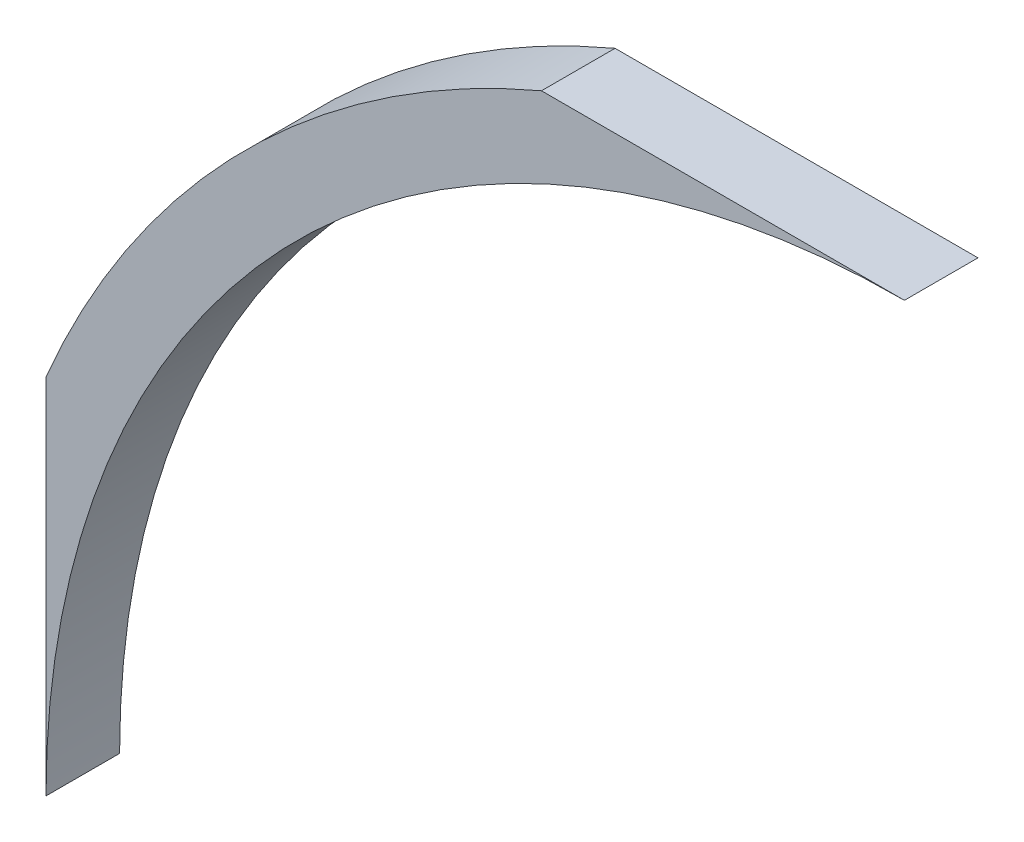
ISO-10303-21;
HEADER;
FILE_DESCRIPTION(('STEP AP214'),'2;1');
FILE_NAME('part.step','',(''),(''),'','','');
FILE_SCHEMA(('AUTOMOTIVE_DESIGN { 1 0 10303 214 1 1 1 1 }'));
ENDSEC;
DATA;
#1=APPLICATION_CONTEXT('core data for automotive mechanical design processes');
#2=APPLICATION_PROTOCOL_DEFINITION('international standard','automotive_design',2000,#1);
#3=PRODUCT_CONTEXT('',#1,'mechanical');
#4=PRODUCT('Part','Part','',(#3));
#5=PRODUCT_RELATED_PRODUCT_CATEGORY('part','',(#4));
#6=PRODUCT_DEFINITION_FORMATION('','',#4);
#7=PRODUCT_DEFINITION_CONTEXT('part definition',#1,'design');
#8=PRODUCT_DEFINITION('design','',#6,#7);
#9=PRODUCT_DEFINITION_SHAPE('','',#8);
#10=(LENGTH_UNIT() NAMED_UNIT(*) SI_UNIT(.MILLI.,.METRE.));
#11=(NAMED_UNIT(*) PLANE_ANGLE_UNIT() SI_UNIT($,.RADIAN.));
#12=(NAMED_UNIT(*) SI_UNIT($,.STERADIAN.) SOLID_ANGLE_UNIT());
#13=UNCERTAINTY_MEASURE_WITH_UNIT(LENGTH_MEASURE(1.E-05),#10,'distance_accuracy_value','');
#14=(GEOMETRIC_REPRESENTATION_CONTEXT(3) GLOBAL_UNCERTAINTY_ASSIGNED_CONTEXT((#13)) GLOBAL_UNIT_ASSIGNED_CONTEXT((#10,
#11,#12)) REPRESENTATION_CONTEXT('',''));
#15=CARTESIAN_POINT('',(0.,0.,0.));
#16=DIRECTION('',(0.,0.,1.));
#17=DIRECTION('',(1.,0.,0.));
#18=AXIS2_PLACEMENT_3D('',#15,#16,#17);
#19=CARTESIAN_POINT('',(0.,0.,6.));
#20=DIRECTION('',(0.,0.,-1.));
#21=DIRECTION('',(-1.,0.,0.));
#22=AXIS2_PLACEMENT_3D('',#19,#20,#21);
#23=CYLINDRICAL_SURFACE('',#22,70.);
#24=CARTESIAN_POINT('',(0.,0.,0.));
#25=DIRECTION('',(0.,0.,-1.));
#26=DIRECTION('',(1.,0.,0.));
#27=AXIS2_PLACEMENT_3D('',#24,#25,#26);
#28=CIRCLE('',#27,70.);
#29=CARTESIAN_POINT('',(-70.,0.,0.));
#30=VERTEX_POINT('',#29);
#31=CARTESIAN_POINT('',(0.,70.,0.));
#32=VERTEX_POINT('',#31);
#33=EDGE_CURVE('E104',#30,#32,#28,.T.);
#34=ORIENTED_EDGE('',*,*,#33,.T.);
#35=DIRECTION('',(0.,0.,-1.));
#36=VECTOR('',#35,1.);
#37=CARTESIAN_POINT('',(0.,70.,6.));
#38=LINE('',#37,#36);
#39=CARTESIAN_POINT('',(0.,70.,6.));
#40=VERTEX_POINT('',#39);
#41=EDGE_CURVE('E11',#40,#32,#38,.T.);
#42=ORIENTED_EDGE('',*,*,#41,.F.);
#43=CARTESIAN_POINT('',(0.,0.,6.));
#44=DIRECTION('',(0.,0.,-1.));
#45=DIRECTION('',(1.,0.,0.));
#46=AXIS2_PLACEMENT_3D('',#43,#44,#45);
#47=CIRCLE('',#46,70.);
#48=CARTESIAN_POINT('',(-70.,0.,6.));
#49=VERTEX_POINT('',#48);
#50=EDGE_CURVE('E92',#49,#40,#47,.T.);
#51=ORIENTED_EDGE('',*,*,#50,.F.);
#52=DIRECTION('',(0.,0.,-1.));
#53=VECTOR('',#52,1.);
#54=CARTESIAN_POINT('',(-70.,0.,6.));
#55=LINE('',#54,#53);
#56=EDGE_CURVE('E100',#49,#30,#55,.T.);
#57=ORIENTED_EDGE('',*,*,#56,.T.);
#58=EDGE_LOOP('',(#34,#42,#51,#57));
#59=FACE_BOUND('',#58,.T.);
#60=ADVANCED_FACE('F41',(#59),#23,.F.);
#61=CARTESIAN_POINT('',(0.,70.,6.));
#62=DIRECTION('',(0.,-1.,0.));
#63=DIRECTION('',(0.,0.,-1.));
#64=AXIS2_PLACEMENT_3D('',#61,#62,#63);
#65=PLANE('',#64);
#66=DIRECTION('',(-1.,0.,0.));
#67=VECTOR('',#66,1.);
#68=CARTESIAN_POINT('',(0.,70.,0.));
#69=LINE('',#68,#67);
#70=CARTESIAN_POINT('',(-29.5972971738975,70.,0.));
#71=VERTEX_POINT('',#70);
#72=EDGE_CURVE('E96',#32,#71,#69,.T.);
#73=ORIENTED_EDGE('',*,*,#72,.T.);
#74=DIRECTION('',(0.,0.,-1.));
#75=VECTOR('',#74,1.);
#76=CARTESIAN_POINT('',(-29.5972971738975,70.,6.));
#77=LINE('',#76,#75);
#78=CARTESIAN_POINT('',(-29.5972971738975,70.,6.));
#79=VERTEX_POINT('',#78);
#80=EDGE_CURVE('E49',#79,#71,#77,.T.);
#81=ORIENTED_EDGE('',*,*,#80,.F.);
#82=DIRECTION('',(-1.,0.,0.));
#83=VECTOR('',#82,1.);
#84=CARTESIAN_POINT('',(0.,70.,6.));
#85=LINE('',#84,#83);
#86=EDGE_CURVE('E87',#40,#79,#85,.T.);
#87=ORIENTED_EDGE('',*,*,#86,.F.);
#88=ORIENTED_EDGE('',*,*,#41,.T.);
#89=EDGE_LOOP('',(#73,#81,#87,#88));
#90=FACE_BOUND('',#89,.T.);
#91=ADVANCED_FACE('F95',(#90),#65,.F.);
#92=CARTESIAN_POINT('',(0.,0.,6.));
#93=DIRECTION('',(0.,0.,-1.));
#94=DIRECTION('',(-1.,0.,0.));
#95=AXIS2_PLACEMENT_3D('',#92,#93,#94);
#96=CYLINDRICAL_SURFACE('',#95,76.);
#97=CARTESIAN_POINT('',(0.,0.,0.));
#98=DIRECTION('',(0.,0.,1.));
#99=DIRECTION('',(1.,0.,0.));
#100=AXIS2_PLACEMENT_3D('',#97,#98,#99);
#101=CIRCLE('',#100,76.);
#102=CARTESIAN_POINT('',(-70.,29.5972971738975,0.));
#103=VERTEX_POINT('',#102);
#104=EDGE_CURVE('E74',#71,#103,#101,.T.);
#105=ORIENTED_EDGE('',*,*,#104,.T.);
#106=DIRECTION('',(0.,0.,-1.));
#107=VECTOR('',#106,1.);
#108=CARTESIAN_POINT('',(-70.,29.5972971738975,6.));
#109=LINE('',#108,#107);
#110=CARTESIAN_POINT('',(-70.,29.5972971738975,6.));
#111=VERTEX_POINT('',#110);
#112=EDGE_CURVE('E97',#111,#103,#109,.T.);
#113=ORIENTED_EDGE('',*,*,#112,.F.);
#114=CARTESIAN_POINT('',(0.,0.,6.));
#115=DIRECTION('',(0.,0.,1.));
#116=DIRECTION('',(1.,0.,0.));
#117=AXIS2_PLACEMENT_3D('',#114,#115,#116);
#118=CIRCLE('',#117,76.);
#119=EDGE_CURVE('E90',#79,#111,#118,.T.);
#120=ORIENTED_EDGE('',*,*,#119,.F.);
#121=ORIENTED_EDGE('',*,*,#80,.T.);
#122=EDGE_LOOP('',(#105,#113,#120,#121));
#123=FACE_BOUND('',#122,.T.);
#124=ADVANCED_FACE('F98',(#123),#96,.T.);
#125=CARTESIAN_POINT('',(-70.,0.,6.));
#126=DIRECTION('',(1.,0.,0.));
#127=DIRECTION('',(0.,1.,0.));
#128=AXIS2_PLACEMENT_3D('',#125,#126,#127);
#129=PLANE('',#128);
#130=DIRECTION('',(0.,-1.,0.));
#131=VECTOR('',#130,1.);
#132=CARTESIAN_POINT('',(-70.,0.,0.));
#133=LINE('',#132,#131);
#134=EDGE_CURVE('E80',#103,#30,#133,.T.);
#135=ORIENTED_EDGE('',*,*,#134,.T.);
#136=ORIENTED_EDGE('',*,*,#56,.F.);
#137=DIRECTION('',(0.,-1.,0.));
#138=VECTOR('',#137,1.);
#139=CARTESIAN_POINT('',(-70.,0.,6.));
#140=LINE('',#139,#138);
#141=EDGE_CURVE('E57',#111,#49,#140,.T.);
#142=ORIENTED_EDGE('',*,*,#141,.F.);
#143=ORIENTED_EDGE('',*,*,#112,.T.);
#144=EDGE_LOOP('',(#135,#136,#142,#143));
#145=FACE_BOUND('',#144,.T.);
#146=ADVANCED_FACE('F111',(#145),#129,.F.);
#147=CARTESIAN_POINT('',(0.,0.,6.));
#148=DIRECTION('',(0.,0.,1.));
#149=DIRECTION('',(1.,0.,0.));
#150=AXIS2_PLACEMENT_3D('',#147,#148,#149);
#151=PLANE('',#150);
#152=ORIENTED_EDGE('',*,*,#50,.T.);
#153=ORIENTED_EDGE('',*,*,#86,.T.);
#154=ORIENTED_EDGE('',*,*,#119,.T.);
#155=ORIENTED_EDGE('',*,*,#141,.T.);
#156=EDGE_LOOP('',(#152,#153,#154,#155));
#157=FACE_BOUND('',#156,.T.);
#158=ADVANCED_FACE('F88',(#157),#151,.T.);
#159=CARTESIAN_POINT('',(0.,0.,0.));
#160=DIRECTION('',(0.,0.,1.));
#161=DIRECTION('',(1.,0.,0.));
#162=AXIS2_PLACEMENT_3D('',#159,#160,#161);
#163=PLANE('',#162);
#164=ORIENTED_EDGE('',*,*,#33,.F.);
#165=ORIENTED_EDGE('',*,*,#134,.F.);
#166=ORIENTED_EDGE('',*,*,#104,.F.);
#167=ORIENTED_EDGE('',*,*,#72,.F.);
#168=EDGE_LOOP('',(#164,#165,#166,#167));
#169=FACE_BOUND('',#168,.T.);
#170=ADVANCED_FACE('F114',(#169),#163,.F.);
#171=CLOSED_SHELL('',(#60,#91,#124,#146,#158,#170));
#172=MANIFOLD_SOLID_BREP('B2',#171);
#173=ADVANCED_BREP_SHAPE_REPRESENTATION('',(#18,#172),#14);
#174=SHAPE_DEFINITION_REPRESENTATION(#9,#173);
ENDSEC;
END-ISO-10303-21;
